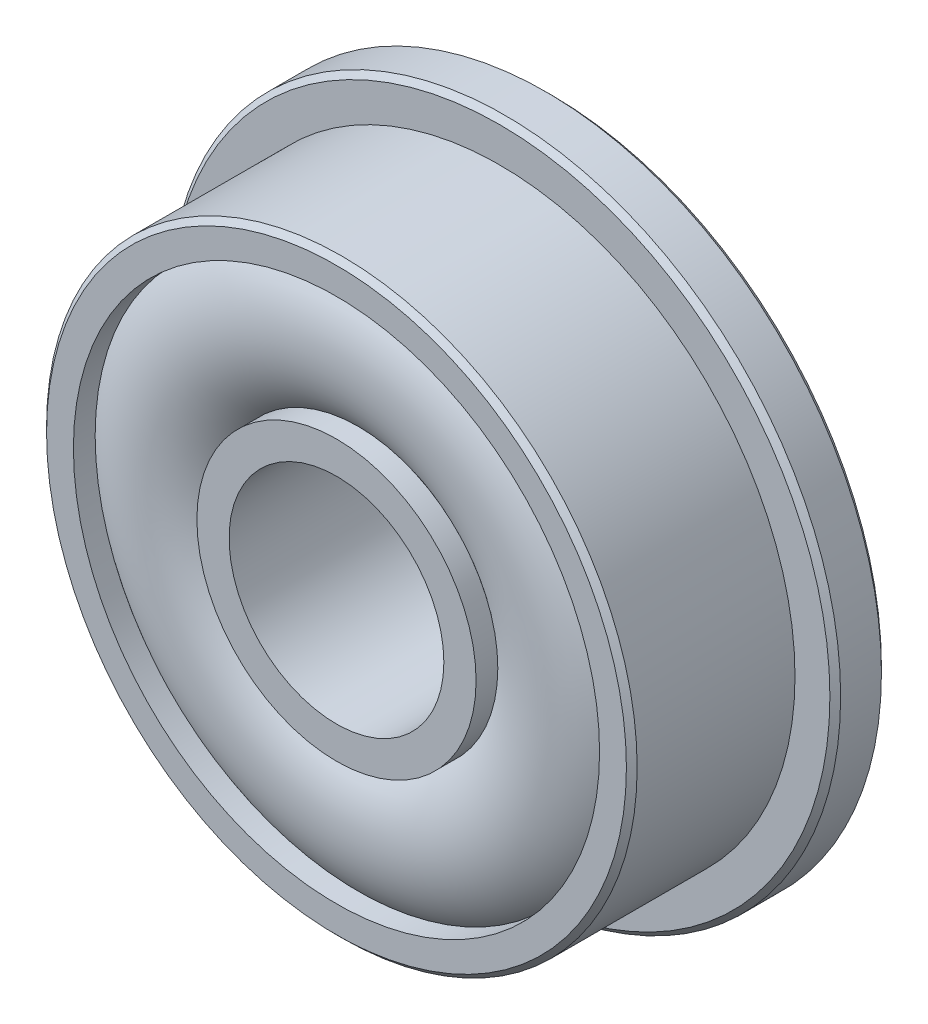
ISO-10303-21;
HEADER;
FILE_DESCRIPTION(('STEP AP214'),'2;1');
FILE_NAME('part.step','',(''),(''),'','','');
FILE_SCHEMA(('AUTOMOTIVE_DESIGN { 1 0 10303 214 1 1 1 1 }'));
ENDSEC;
DATA;
#1=APPLICATION_CONTEXT('core data for automotive mechanical design processes');
#2=APPLICATION_PROTOCOL_DEFINITION('international standard','automotive_design',2000,#1);
#3=PRODUCT_CONTEXT('',#1,'mechanical');
#4=PRODUCT('Part','Part','',(#3));
#5=PRODUCT_RELATED_PRODUCT_CATEGORY('part','',(#4));
#6=PRODUCT_DEFINITION_FORMATION('','',#4);
#7=PRODUCT_DEFINITION_CONTEXT('part definition',#1,'design');
#8=PRODUCT_DEFINITION('design','',#6,#7);
#9=PRODUCT_DEFINITION_SHAPE('','',#8);
#10=(LENGTH_UNIT() NAMED_UNIT(*) SI_UNIT(.MILLI.,.METRE.));
#11=(NAMED_UNIT(*) PLANE_ANGLE_UNIT() SI_UNIT($,.RADIAN.));
#12=(NAMED_UNIT(*) SI_UNIT($,.STERADIAN.) SOLID_ANGLE_UNIT());
#13=UNCERTAINTY_MEASURE_WITH_UNIT(LENGTH_MEASURE(1.E-05),#10,'distance_accuracy_value','');
#14=(GEOMETRIC_REPRESENTATION_CONTEXT(3) GLOBAL_UNCERTAINTY_ASSIGNED_CONTEXT((#13)) GLOBAL_UNIT_ASSIGNED_CONTEXT((#10,
#11,#12)) REPRESENTATION_CONTEXT('',''));
#15=CARTESIAN_POINT('',(0.,0.,0.));
#16=DIRECTION('',(0.,0.,1.));
#17=DIRECTION('',(1.,0.,0.));
#18=AXIS2_PLACEMENT_3D('',#15,#16,#17);
#19=CARTESIAN_POINT('',(0.,2.,2.));
#20=DIRECTION('',(0.,0.,-1.));
#21=DIRECTION('',(-1.,0.,0.));
#22=AXIS2_PLACEMENT_3D('',#19,#20,#21);
#23=PLANE('',#22);
#24=CARTESIAN_POINT('',(0.,0.,2.));
#25=DIRECTION('',(0.,0.,1.));
#26=DIRECTION('',(1.,0.,0.));
#27=AXIS2_PLACEMENT_3D('',#24,#25,#26);
#28=CIRCLE('',#27,2.);
#29=CARTESIAN_POINT('',(2.,0.,2.));
#30=VERTEX_POINT('',#29);
#31=EDGE_CURVE('E58',#30,#30,#28,.T.);
#32=ORIENTED_EDGE('',*,*,#31,.F.);
#33=EDGE_LOOP('',(#32));
#34=FACE_BOUND('',#33,.T.);
#35=CARTESIAN_POINT('',(0.,0.,2.));
#36=DIRECTION('',(0.,0.,1.));
#37=DIRECTION('',(1.,0.,0.));
#38=AXIS2_PLACEMENT_3D('',#35,#36,#37);
#39=CIRCLE('',#38,2.6);
#40=CARTESIAN_POINT('',(2.6,0.,2.));
#41=VERTEX_POINT('',#40);
#42=EDGE_CURVE('E88',#41,#41,#39,.T.);
#43=ORIENTED_EDGE('',*,*,#42,.T.);
#44=EDGE_LOOP('',(#43));
#45=FACE_BOUND('',#44,.T.);
#46=ADVANCED_FACE('F32',(#34,#45),#23,.F.);
#47=CARTESIAN_POINT('',(0.,0.,0.));
#48=DIRECTION('',(0.,0.,1.));
#49=DIRECTION('',(1.,0.,0.));
#50=AXIS2_PLACEMENT_3D('',#47,#48,#49);
#51=CYLINDRICAL_SURFACE('',#50,2.);
#52=CARTESIAN_POINT('',(0.,0.,-2.));
#53=DIRECTION('',(0.,0.,1.));
#54=DIRECTION('',(1.,0.,0.));
#55=AXIS2_PLACEMENT_3D('',#52,#53,#54);
#56=CIRCLE('',#55,2.);
#57=CARTESIAN_POINT('',(2.,0.,-2.));
#58=VERTEX_POINT('',#57);
#59=EDGE_CURVE('E61',#58,#58,#56,.T.);
#60=ORIENTED_EDGE('',*,*,#59,.F.);
#61=EDGE_LOOP('',(#60));
#62=FACE_BOUND('',#61,.T.);
#63=ORIENTED_EDGE('',*,*,#31,.T.);
#64=EDGE_LOOP('',(#63));
#65=FACE_BOUND('',#64,.T.);
#66=ADVANCED_FACE('F122',(#62,#65),#51,.F.);
#67=CARTESIAN_POINT('',(0.,2.,-2.));
#68=DIRECTION('',(0.,0.,1.));
#69=DIRECTION('',(1.,0.,0.));
#70=AXIS2_PLACEMENT_3D('',#67,#68,#69);
#71=PLANE('',#70);
#72=CARTESIAN_POINT('',(0.,0.,-2.));
#73=DIRECTION('',(0.,0.,1.));
#74=DIRECTION('',(1.,0.,0.));
#75=AXIS2_PLACEMENT_3D('',#72,#73,#74);
#76=CIRCLE('',#75,2.6);
#77=CARTESIAN_POINT('',(2.6,0.,-2.));
#78=VERTEX_POINT('',#77);
#79=EDGE_CURVE('E64',#78,#78,#76,.T.);
#80=ORIENTED_EDGE('',*,*,#79,.F.);
#81=EDGE_LOOP('',(#80));
#82=FACE_BOUND('',#81,.T.);
#83=ORIENTED_EDGE('',*,*,#59,.T.);
#84=EDGE_LOOP('',(#83));
#85=FACE_BOUND('',#84,.T.);
#86=ADVANCED_FACE('F128',(#82,#85),#71,.F.);
#87=CARTESIAN_POINT('',(0.,0.,0.));
#88=DIRECTION('',(0.,0.,1.));
#89=DIRECTION('',(1.,0.,0.));
#90=AXIS2_PLACEMENT_3D('',#87,#88,#89);
#91=CYLINDRICAL_SURFACE('',#90,2.6);
#92=CARTESIAN_POINT('',(0.,0.,-1.59495106800023));
#93=DIRECTION('',(0.,0.,1.));
#94=DIRECTION('',(1.,0.,0.));
#95=AXIS2_PLACEMENT_3D('',#92,#93,#94);
#96=CIRCLE('',#95,2.6);
#97=CARTESIAN_POINT('',(2.6,0.,-1.59495106800023));
#98=VERTEX_POINT('',#97);
#99=EDGE_CURVE('E67',#98,#98,#96,.T.);
#100=ORIENTED_EDGE('',*,*,#99,.F.);
#101=EDGE_LOOP('',(#100));
#102=FACE_BOUND('',#101,.T.);
#103=ORIENTED_EDGE('',*,*,#79,.T.);
#104=EDGE_LOOP('',(#103));
#105=FACE_BOUND('',#104,.T.);
#106=ADVANCED_FACE('F168',(#102,#105),#91,.T.);
#107=CARTESIAN_POINT('',(0.,0.,-0.164956725135874));
#108=DIRECTION('',(0.,0.,1.));
#109=DIRECTION('',(1.,0.,0.));
#110=AXIS2_PLACEMENT_3D('',#107,#108,#109);
#111=TOROIDAL_SURFACE('',#110,3.75,1.83504327486413);
#112=CARTESIAN_POINT('',(0.,0.,-1.59495106800023));
#113=DIRECTION('',(0.,0.,1.));
#114=DIRECTION('',(1.,0.,0.));
#115=AXIS2_PLACEMENT_3D('',#112,#113,#114);
#116=CIRCLE('',#115,4.9);
#117=CARTESIAN_POINT('',(4.9,0.,-1.59495106800023));
#118=VERTEX_POINT('',#117);
#119=EDGE_CURVE('E70',#118,#118,#116,.T.);
#120=ORIENTED_EDGE('',*,*,#119,.F.);
#121=EDGE_LOOP('',(#120));
#122=FACE_BOUND('',#121,.T.);
#123=ORIENTED_EDGE('',*,*,#99,.T.);
#124=EDGE_LOOP('',(#123));
#125=FACE_BOUND('',#124,.T.);
#126=ADVANCED_FACE('F164',(#122,#125),#111,.T.);
#127=CARTESIAN_POINT('',(0.,0.,0.));
#128=DIRECTION('',(0.,0.,1.));
#129=DIRECTION('',(1.,0.,0.));
#130=AXIS2_PLACEMENT_3D('',#127,#128,#129);
#131=CYLINDRICAL_SURFACE('',#130,4.9);
#132=CARTESIAN_POINT('',(0.,0.,-2.));
#133=DIRECTION('',(0.,0.,1.));
#134=DIRECTION('',(1.,0.,0.));
#135=AXIS2_PLACEMENT_3D('',#132,#133,#134);
#136=CIRCLE('',#135,4.9);
#137=CARTESIAN_POINT('',(4.9,0.,-2.));
#138=VERTEX_POINT('',#137);
#139=EDGE_CURVE('E73',#138,#138,#136,.T.);
#140=ORIENTED_EDGE('',*,*,#139,.F.);
#141=EDGE_LOOP('',(#140));
#142=FACE_BOUND('',#141,.T.);
#143=ORIENTED_EDGE('',*,*,#119,.T.);
#144=EDGE_LOOP('',(#143));
#145=FACE_BOUND('',#144,.T.);
#146=ADVANCED_FACE('F158',(#142,#145),#131,.F.);
#147=CARTESIAN_POINT('',(0.,4.9,-2.));
#148=DIRECTION('',(0.,0.,1.));
#149=DIRECTION('',(1.,0.,0.));
#150=AXIS2_PLACEMENT_3D('',#147,#148,#149);
#151=PLANE('',#150);
#152=CARTESIAN_POINT('',(0.,0.,-2.));
#153=DIRECTION('',(0.,0.,1.));
#154=DIRECTION('',(1.,0.,0.));
#155=AXIS2_PLACEMENT_3D('',#152,#153,#154);
#156=CIRCLE('',#155,6.15);
#157=CARTESIAN_POINT('',(6.15,0.,-2.));
#158=VERTEX_POINT('',#157);
#159=EDGE_CURVE('E43',#158,#158,#156,.F.);
#160=ORIENTED_EDGE('',*,*,#159,.T.);
#161=EDGE_LOOP('',(#160));
#162=FACE_BOUND('',#161,.T.);
#163=ORIENTED_EDGE('',*,*,#139,.T.);
#164=EDGE_LOOP('',(#163));
#165=FACE_BOUND('',#164,.T.);
#166=ADVANCED_FACE('F149',(#162,#165),#151,.F.);
#167=CARTESIAN_POINT('',(0.,0.,0.));
#168=DIRECTION('',(0.,0.,1.));
#169=DIRECTION('',(1.,0.,0.));
#170=AXIS2_PLACEMENT_3D('',#167,#168,#169);
#171=CYLINDRICAL_SURFACE('',#170,6.25);
#172=CARTESIAN_POINT('',(0.,0.,-1.14000000000001));
#173=DIRECTION('',(0.,0.,-1.));
#174=DIRECTION('',(-1.,0.,0.));
#175=AXIS2_PLACEMENT_3D('',#172,#173,#174);
#176=CIRCLE('',#175,6.25);
#177=CARTESIAN_POINT('',(-6.25,0.,-1.14000000000001));
#178=VERTEX_POINT('',#177);
#179=EDGE_CURVE('E47',#178,#178,#176,.T.);
#180=ORIENTED_EDGE('',*,*,#179,.T.);
#181=EDGE_LOOP('',(#180));
#182=FACE_BOUND('',#181,.T.);
#183=CARTESIAN_POINT('',(0.,0.,-1.9));
#184=DIRECTION('',(0.,0.,1.));
#185=DIRECTION('',(1.,0.,0.));
#186=AXIS2_PLACEMENT_3D('',#183,#184,#185);
#187=CIRCLE('',#186,6.25);
#188=CARTESIAN_POINT('',(6.25,0.,-1.9));
#189=VERTEX_POINT('',#188);
#190=EDGE_CURVE('E52',#189,#189,#187,.T.);
#191=ORIENTED_EDGE('',*,*,#190,.T.);
#192=EDGE_LOOP('',(#191));
#193=FACE_BOUND('',#192,.T.);
#194=ADVANCED_FACE('F147',(#182,#193),#171,.T.);
#195=CARTESIAN_POINT('',(0.,5.5,-1.04));
#196=DIRECTION('',(0.,0.,-1.));
#197=DIRECTION('',(-1.,0.,0.));
#198=AXIS2_PLACEMENT_3D('',#195,#196,#197);
#199=PLANE('',#198);
#200=CARTESIAN_POINT('',(0.,0.,-1.04));
#201=DIRECTION('',(0.,0.,-1.));
#202=DIRECTION('',(-1.,0.,0.));
#203=AXIS2_PLACEMENT_3D('',#200,#201,#202);
#204=CIRCLE('',#203,6.14999999999999);
#205=CARTESIAN_POINT('',(-6.14999999999999,0.,-1.04));
#206=VERTEX_POINT('',#205);
#207=EDGE_CURVE('E55',#206,#206,#204,.F.);
#208=ORIENTED_EDGE('',*,*,#207,.T.);
#209=EDGE_LOOP('',(#208));
#210=FACE_BOUND('',#209,.T.);
#211=CARTESIAN_POINT('',(0.,0.,-1.04));
#212=DIRECTION('',(0.,0.,1.));
#213=DIRECTION('',(1.,0.,0.));
#214=AXIS2_PLACEMENT_3D('',#211,#212,#213);
#215=CIRCLE('',#214,5.5);
#216=CARTESIAN_POINT('',(5.5,0.,-1.04));
#217=VERTEX_POINT('',#216);
#218=EDGE_CURVE('E76',#217,#217,#215,.T.);
#219=ORIENTED_EDGE('',*,*,#218,.F.);
#220=EDGE_LOOP('',(#219));
#221=FACE_BOUND('',#220,.T.);
#222=ADVANCED_FACE('F119',(#210,#221),#199,.F.);
#223=CARTESIAN_POINT('',(0.,0.,0.));
#224=DIRECTION('',(0.,0.,1.));
#225=DIRECTION('',(1.,0.,0.));
#226=AXIS2_PLACEMENT_3D('',#223,#224,#225);
#227=CYLINDRICAL_SURFACE('',#226,5.5);
#228=CARTESIAN_POINT('',(0.,0.,1.9));
#229=DIRECTION('',(0.,0.,-1.));
#230=DIRECTION('',(-1.,0.,0.));
#231=AXIS2_PLACEMENT_3D('',#228,#229,#230);
#232=CIRCLE('',#231,5.5);
#233=CARTESIAN_POINT('',(-5.5,0.,1.9));
#234=VERTEX_POINT('',#233);
#235=EDGE_CURVE('E10',#234,#234,#232,.T.);
#236=ORIENTED_EDGE('',*,*,#235,.T.);
#237=EDGE_LOOP('',(#236));
#238=FACE_BOUND('',#237,.T.);
#239=ORIENTED_EDGE('',*,*,#218,.T.);
#240=EDGE_LOOP('',(#239));
#241=FACE_BOUND('',#240,.T.);
#242=ADVANCED_FACE('F114',(#238,#241),#227,.T.);
#243=CARTESIAN_POINT('',(0.,4.9,2.));
#244=DIRECTION('',(0.,0.,-1.));
#245=DIRECTION('',(-1.,0.,0.));
#246=AXIS2_PLACEMENT_3D('',#243,#244,#245);
#247=PLANE('',#246);
#248=CARTESIAN_POINT('',(0.,0.,2.));
#249=DIRECTION('',(0.,0.,-1.));
#250=DIRECTION('',(-1.,0.,0.));
#251=AXIS2_PLACEMENT_3D('',#248,#249,#250);
#252=CIRCLE('',#251,5.4);
#253=CARTESIAN_POINT('',(-5.4,0.,2.));
#254=VERTEX_POINT('',#253);
#255=EDGE_CURVE('E39',#254,#254,#252,.F.);
#256=ORIENTED_EDGE('',*,*,#255,.T.);
#257=EDGE_LOOP('',(#256));
#258=FACE_BOUND('',#257,.T.);
#259=CARTESIAN_POINT('',(0.,0.,2.));
#260=DIRECTION('',(0.,0.,1.));
#261=DIRECTION('',(1.,0.,0.));
#262=AXIS2_PLACEMENT_3D('',#259,#260,#261);
#263=CIRCLE('',#262,4.9);
#264=CARTESIAN_POINT('',(4.9,0.,2.));
#265=VERTEX_POINT('',#264);
#266=EDGE_CURVE('E79',#265,#265,#263,.T.);
#267=ORIENTED_EDGE('',*,*,#266,.F.);
#268=EDGE_LOOP('',(#267));
#269=FACE_BOUND('',#268,.T.);
#270=ADVANCED_FACE('F109',(#258,#269),#247,.F.);
#271=CARTESIAN_POINT('',(0.,0.,0.));
#272=DIRECTION('',(0.,0.,1.));
#273=DIRECTION('',(1.,0.,0.));
#274=AXIS2_PLACEMENT_3D('',#271,#272,#273);
#275=CYLINDRICAL_SURFACE('',#274,4.9);
#276=CARTESIAN_POINT('',(0.,0.,1.59495106800023));
#277=DIRECTION('',(0.,0.,1.));
#278=DIRECTION('',(1.,0.,0.));
#279=AXIS2_PLACEMENT_3D('',#276,#277,#278);
#280=CIRCLE('',#279,4.9);
#281=CARTESIAN_POINT('',(4.9,0.,1.59495106800023));
#282=VERTEX_POINT('',#281);
#283=EDGE_CURVE('E82',#282,#282,#280,.T.);
#284=ORIENTED_EDGE('',*,*,#283,.F.);
#285=EDGE_LOOP('',(#284));
#286=FACE_BOUND('',#285,.T.);
#287=ORIENTED_EDGE('',*,*,#266,.T.);
#288=EDGE_LOOP('',(#287));
#289=FACE_BOUND('',#288,.T.);
#290=ADVANCED_FACE('F103',(#286,#289),#275,.F.);
#291=CARTESIAN_POINT('',(0.,0.,0.164956725135875));
#292=DIRECTION('',(0.,0.,1.));
#293=DIRECTION('',(1.,0.,0.));
#294=AXIS2_PLACEMENT_3D('',#291,#292,#293);
#295=TOROIDAL_SURFACE('',#294,3.75,1.83504327486413);
#296=CARTESIAN_POINT('',(0.,0.,1.59495106800023));
#297=DIRECTION('',(0.,0.,1.));
#298=DIRECTION('',(1.,0.,0.));
#299=AXIS2_PLACEMENT_3D('',#296,#297,#298);
#300=CIRCLE('',#299,2.6);
#301=CARTESIAN_POINT('',(2.6,0.,1.59495106800023));
#302=VERTEX_POINT('',#301);
#303=EDGE_CURVE('E85',#302,#302,#300,.T.);
#304=ORIENTED_EDGE('',*,*,#303,.F.);
#305=EDGE_LOOP('',(#304));
#306=FACE_BOUND('',#305,.T.);
#307=ORIENTED_EDGE('',*,*,#283,.T.);
#308=EDGE_LOOP('',(#307));
#309=FACE_BOUND('',#308,.T.);
#310=ADVANCED_FACE('F97',(#306,#309),#295,.T.);
#311=CARTESIAN_POINT('',(0.,0.,0.));
#312=DIRECTION('',(0.,0.,1.));
#313=DIRECTION('',(1.,0.,0.));
#314=AXIS2_PLACEMENT_3D('',#311,#312,#313);
#315=CYLINDRICAL_SURFACE('',#314,2.6);
#316=ORIENTED_EDGE('',*,*,#42,.F.);
#317=EDGE_LOOP('',(#316));
#318=FACE_BOUND('',#317,.T.);
#319=ORIENTED_EDGE('',*,*,#303,.T.);
#320=EDGE_LOOP('',(#319));
#321=FACE_BOUND('',#320,.T.);
#322=ADVANCED_FACE('F93',(#318,#321),#315,.T.);
#323=CARTESIAN_POINT('',(0.,0.,-1.04));
#324=DIRECTION('',(0.,0.,-1.));
#325=DIRECTION('',(-1.,0.,0.));
#326=AXIS2_PLACEMENT_3D('',#323,#324,#325);
#327=CONICAL_SURFACE('',#326,6.14999999999999,0.785398163397453);
#328=ORIENTED_EDGE('',*,*,#179,.F.);
#329=EDGE_LOOP('',(#328));
#330=FACE_BOUND('',#329,.T.);
#331=ORIENTED_EDGE('',*,*,#207,.F.);
#332=EDGE_LOOP('',(#331));
#333=FACE_BOUND('',#332,.T.);
#334=ADVANCED_FACE('F96',(#330,#333),#327,.T.);
#335=CARTESIAN_POINT('',(0.,0.,-1.9));
#336=DIRECTION('',(0.,0.,1.));
#337=DIRECTION('',(1.,0.,0.));
#338=AXIS2_PLACEMENT_3D('',#335,#336,#337);
#339=CONICAL_SURFACE('',#338,6.25,0.785398163397453);
#340=CARTESIAN_POINT('',(6.15,0.,-2.));
#341=CARTESIAN_POINT('',(6.15104166666667,0.,-1.99895833333333));
#342=CARTESIAN_POINT('',(6.15208333333334,0.,-1.99791666666667));
#343=CARTESIAN_POINT('',(6.15416666666667,0.,-1.99583333333333));
#344=CARTESIAN_POINT('',(6.15520833333334,0.,-1.99479166666667));
#345=CARTESIAN_POINT('',(6.15729166666667,0.,-1.99270833333333));
#346=CARTESIAN_POINT('',(6.15833333333334,0.,-1.99166666666667));
#347=CARTESIAN_POINT('',(6.16041666666667,0.,-1.98958333333333));
#348=CARTESIAN_POINT('',(6.16145833333334,0.,-1.98854166666667));
#349=CARTESIAN_POINT('',(6.16354166666667,0.,-1.98645833333333));
#350=CARTESIAN_POINT('',(6.16458333333334,0.,-1.98541666666667));
#351=CARTESIAN_POINT('',(6.16666666666667,0.,-1.98333333333333));
#352=CARTESIAN_POINT('',(6.16770833333334,0.,-1.98229166666667));
#353=CARTESIAN_POINT('',(6.16979166666667,0.,-1.98020833333333));
#354=CARTESIAN_POINT('',(6.17083333333334,0.,-1.97916666666667));
#355=CARTESIAN_POINT('',(6.17291666666667,0.,-1.97708333333333));
#356=CARTESIAN_POINT('',(6.17395833333333,0.,-1.97604166666667));
#357=CARTESIAN_POINT('',(6.17604166666667,0.,-1.97395833333333));
#358=CARTESIAN_POINT('',(6.17708333333334,0.,-1.97291666666667));
#359=CARTESIAN_POINT('',(6.17916666666667,0.,-1.97083333333333));
#360=CARTESIAN_POINT('',(6.18020833333334,0.,-1.96979166666667));
#361=CARTESIAN_POINT('',(6.18229166666667,0.,-1.96770833333333));
#362=CARTESIAN_POINT('',(6.18333333333334,0.,-1.96666666666667));
#363=CARTESIAN_POINT('',(6.18541666666667,0.,-1.96458333333333));
#364=CARTESIAN_POINT('',(6.18645833333334,0.,-1.96354166666667));
#365=CARTESIAN_POINT('',(6.18854166666667,0.,-1.96145833333333));
#366=CARTESIAN_POINT('',(6.18958333333333,0.,-1.96041666666667));
#367=CARTESIAN_POINT('',(6.19166666666667,0.,-1.95833333333333));
#368=CARTESIAN_POINT('',(6.19270833333333,0.,-1.95729166666667));
#369=CARTESIAN_POINT('',(6.19479166666667,0.,-1.95520833333333));
#370=CARTESIAN_POINT('',(6.19583333333333,0.,-1.95416666666667));
#371=CARTESIAN_POINT('',(6.19791666666667,0.,-1.95208333333333));
#372=CARTESIAN_POINT('',(6.19895833333334,0.,-1.95104166666667));
#373=CARTESIAN_POINT('',(6.20104166666667,0.,-1.94895833333333));
#374=CARTESIAN_POINT('',(6.20208333333333,0.,-1.94791666666667));
#375=CARTESIAN_POINT('',(6.20416666666667,0.,-1.94583333333333));
#376=CARTESIAN_POINT('',(6.20520833333333,0.,-1.94479166666667));
#377=CARTESIAN_POINT('',(6.20729166666667,0.,-1.94270833333333));
#378=CARTESIAN_POINT('',(6.20833333333333,0.,-1.94166666666667));
#379=CARTESIAN_POINT('',(6.21041666666667,0.,-1.93958333333333));
#380=CARTESIAN_POINT('',(6.21145833333333,0.,-1.93854166666667));
#381=CARTESIAN_POINT('',(6.21354166666667,0.,-1.93645833333333));
#382=CARTESIAN_POINT('',(6.21458333333333,0.,-1.93541666666667));
#383=CARTESIAN_POINT('',(6.21666666666667,0.,-1.93333333333333));
#384=CARTESIAN_POINT('',(6.21770833333333,0.,-1.93229166666667));
#385=CARTESIAN_POINT('',(6.21979166666667,0.,-1.93020833333334));
#386=CARTESIAN_POINT('',(6.22083333333333,0.,-1.92916666666667));
#387=CARTESIAN_POINT('',(6.22291666666667,0.,-1.92708333333333));
#388=CARTESIAN_POINT('',(6.22395833333333,0.,-1.92604166666667));
#389=CARTESIAN_POINT('',(6.22604166666667,0.,-1.92395833333333));
#390=CARTESIAN_POINT('',(6.22708333333333,0.,-1.92291666666667));
#391=CARTESIAN_POINT('',(6.22916666666667,0.,-1.92083333333334));
#392=CARTESIAN_POINT('',(6.23020833333333,0.,-1.91979166666667));
#393=CARTESIAN_POINT('',(6.23229166666667,0.,-1.91770833333334));
#394=CARTESIAN_POINT('',(6.23333333333333,0.,-1.91666666666667));
#395=CARTESIAN_POINT('',(6.23541666666667,0.,-1.91458333333334));
#396=CARTESIAN_POINT('',(6.23645833333333,0.,-1.91354166666667));
#397=CARTESIAN_POINT('',(6.23854166666667,0.,-1.91145833333334));
#398=CARTESIAN_POINT('',(6.23958333333333,0.,-1.91041666666667));
#399=CARTESIAN_POINT('',(6.24166666666667,0.,-1.90833333333334));
#400=CARTESIAN_POINT('',(6.24270833333333,0.,-1.90729166666667));
#401=CARTESIAN_POINT('',(6.24479166666667,0.,-1.90520833333334));
#402=CARTESIAN_POINT('',(6.24583333333333,0.,-1.90416666666667));
#403=CARTESIAN_POINT('',(6.24791666666667,0.,-1.90208333333334));
#404=CARTESIAN_POINT('',(6.24895833333333,0.,-1.90104166666667));
#405=CARTESIAN_POINT('',(6.25,0.,-1.9));
#406=B_SPLINE_CURVE_WITH_KNOTS('',3,(#340,#341,#342,#343,#344,#345,#346,#347,#348,#349,#350,
#351,#352,#353,#354,#355,#356,#357,#358,#359,#360,#361,#362,#363,#364,#365,#366,#367,#368,#369,
#370,#371,#372,#373,#374,#375,#376,#377,#378,#379,#380,#381,#382,#383,#384,#385,#386,#387,#388,
#389,#390,#391,#392,#393,#394,#395,#396,#397,#398,#399,#400,#401,#402,#403,#404,#405),
.UNSPECIFIED.,.F.,.F.,(4,2,2,2,2,2,2,2,2,2,2,2,2,2,2,2,2,2,2,2,2,2,2,2,2,2,2,2,2,2,2,2,4),(0.,
0.00441941738241574,0.00883883476483148,0.0132582521472475,0.0176776695296633,
0.0220970869120787,0.0265165042944951,0.0309359216769105,0.0353553390593262,0.0397747564417426,
0.044194173824158,0.0486135912065738,0.0530330085889898,0.0574524259714055,0.061871843353821,
0.0662912607362367,0.0707106781186529,0.0751300955010685,0.0795495128834842,0.0839689302659005,
0.088388347648316,0.0928077650307316,0.0972271824131478,0.101646599795563,0.106066017177979,
0.110485434560395,0.114904851942811,0.119324269325227,0.123743686707643,0.128163104090058,
0.132582521472474,0.13700193885489,0.141421356237306),.UNSPECIFIED.);
#407=EDGE_CURVE('BSEAM135',#158,#189,#406,.T.);
#408=ORIENTED_EDGE('',*,*,#159,.F.);
#409=ORIENTED_EDGE('',*,*,#190,.F.);
#410=ORIENTED_EDGE('',*,*,#407,.T.);
#411=ORIENTED_EDGE('',*,*,#407,.F.);
#412=EDGE_LOOP('',(#408,#410,#409,#411));
#413=FACE_BOUND('',#412,.T.);
#414=ADVANCED_FACE('F135',(#413),#339,.T.);
#415=CARTESIAN_POINT('',(0.,0.,2.));
#416=DIRECTION('',(0.,0.,-1.));
#417=DIRECTION('',(-1.,0.,0.));
#418=AXIS2_PLACEMENT_3D('',#415,#416,#417);
#419=CONICAL_SURFACE('',#418,5.4,0.785398163397457);
#420=ORIENTED_EDGE('',*,*,#235,.F.);
#421=EDGE_LOOP('',(#420));
#422=FACE_BOUND('',#421,.T.);
#423=ORIENTED_EDGE('',*,*,#255,.F.);
#424=EDGE_LOOP('',(#423));
#425=FACE_BOUND('',#424,.T.);
#426=ADVANCED_FACE('F34',(#422,#425),#419,.T.);
#427=CLOSED_SHELL('',(#46,#66,#86,#106,#126,#146,#166,#194,#222,#242,#270,#290,#310,#322,#334,
#414,#426));
#428=MANIFOLD_SOLID_BREP('B2',#427);
#429=ADVANCED_BREP_SHAPE_REPRESENTATION('',(#18,#428),#14);
#430=SHAPE_DEFINITION_REPRESENTATION(#9,#429);
ENDSEC;
END-ISO-10303-21;
